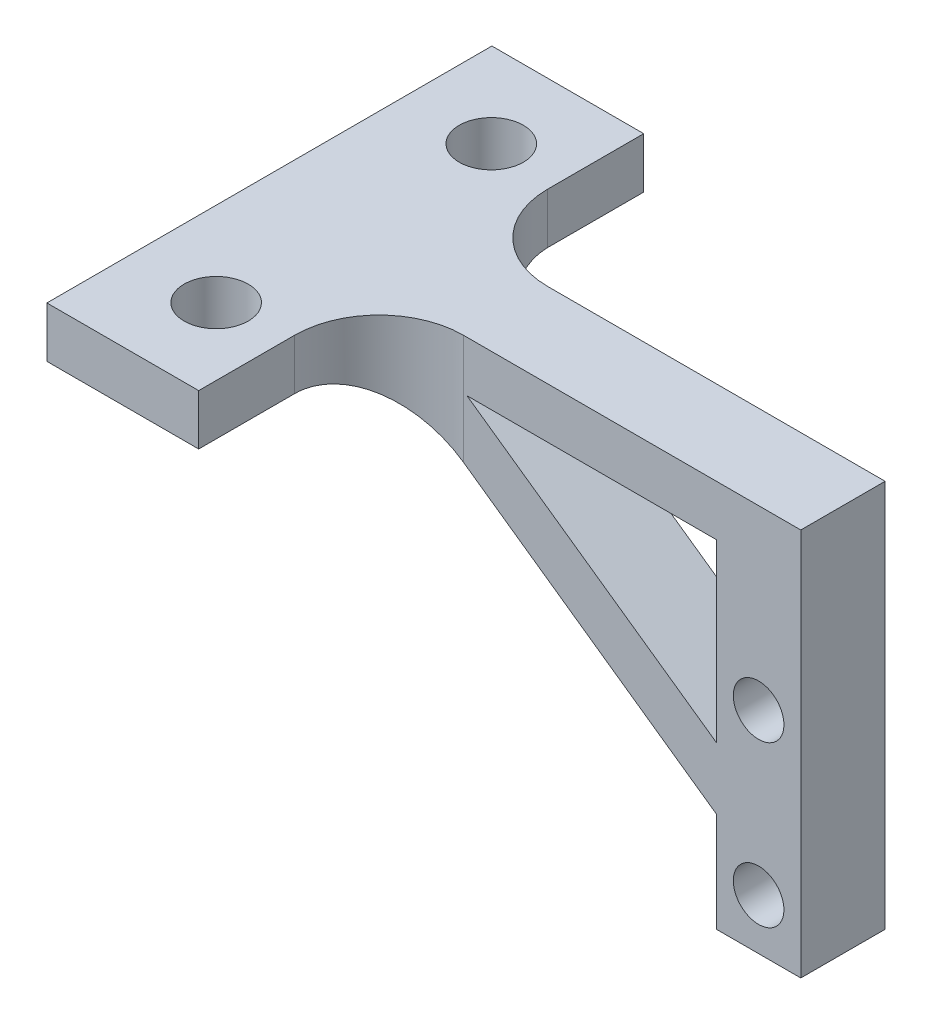
ISO-10303-21;
HEADER;
FILE_DESCRIPTION(('STEP AP214'),'2;1');
FILE_NAME('part.step','',(''),(''),'','','');
FILE_SCHEMA(('AUTOMOTIVE_DESIGN { 1 0 10303 214 1 1 1 1 }'));
ENDSEC;
DATA;
#1=APPLICATION_CONTEXT('core data for automotive mechanical design processes');
#2=APPLICATION_PROTOCOL_DEFINITION('international standard','automotive_design',2000,#1);
#3=PRODUCT_CONTEXT('',#1,'mechanical');
#4=PRODUCT('Part','Part','',(#3));
#5=PRODUCT_RELATED_PRODUCT_CATEGORY('part','',(#4));
#6=PRODUCT_DEFINITION_FORMATION('','',#4);
#7=PRODUCT_DEFINITION_CONTEXT('part definition',#1,'design');
#8=PRODUCT_DEFINITION('design','',#6,#7);
#9=PRODUCT_DEFINITION_SHAPE('','',#8);
#10=(LENGTH_UNIT() NAMED_UNIT(*) SI_UNIT(.MILLI.,.METRE.));
#11=(NAMED_UNIT(*) PLANE_ANGLE_UNIT() SI_UNIT($,.RADIAN.));
#12=(NAMED_UNIT(*) SI_UNIT($,.STERADIAN.) SOLID_ANGLE_UNIT());
#13=UNCERTAINTY_MEASURE_WITH_UNIT(LENGTH_MEASURE(1.E-05),#10,'distance_accuracy_value','');
#14=(GEOMETRIC_REPRESENTATION_CONTEXT(3) GLOBAL_UNCERTAINTY_ASSIGNED_CONTEXT((#13)) GLOBAL_UNIT_ASSIGNED_CONTEXT((#10,
#11,#12)) REPRESENTATION_CONTEXT('',''));
#15=CARTESIAN_POINT('',(0.,0.,0.));
#16=DIRECTION('',(0.,0.,1.));
#17=DIRECTION('',(1.,0.,0.));
#18=AXIS2_PLACEMENT_3D('',#15,#16,#17);
#19=CARTESIAN_POINT('',(0.,0.,0.));
#20=DIRECTION('',(0.,-1.,0.));
#21=DIRECTION('',(0.,0.,-1.));
#22=AXIS2_PLACEMENT_3D('',#19,#20,#21);
#23=PLANE('',#22);
#24=DIRECTION('',(-1.,0.,0.));
#25=VECTOR('',#24,1.);
#26=CARTESIAN_POINT('',(29.,0.,-5.655));
#27=LINE('',#26,#25);
#28=CARTESIAN_POINT('',(24.,0.,-5.655));
#29=VERTEX_POINT('',#28);
#30=CARTESIAN_POINT('',(9.21030531511632,0.,-5.655));
#31=VERTEX_POINT('',#30);
#32=EDGE_CURVE('E251',#29,#31,#27,.T.);
#33=ORIENTED_EDGE('',*,*,#32,.T.);
#34=DIRECTION('',(0.,0.,1.));
#35=VECTOR('',#34,1.);
#36=CARTESIAN_POINT('',(9.21030531511632,0.,-35.1167419759106));
#37=LINE('',#36,#35);
#38=CARTESIAN_POINT('',(9.21030531511632,0.,-10.655));
#39=VERTEX_POINT('',#38);
#40=EDGE_CURVE('E112',#39,#31,#37,.T.);
#41=ORIENTED_EDGE('',*,*,#40,.F.);
#42=DIRECTION('',(-1.,0.,0.));
#43=VECTOR('',#42,1.);
#44=CARTESIAN_POINT('',(29.,0.,-10.655));
#45=LINE('',#44,#43);
#46=CARTESIAN_POINT('',(24.,0.,-10.655));
#47=VERTEX_POINT('',#46);
#48=EDGE_CURVE('E248',#47,#39,#45,.T.);
#49=ORIENTED_EDGE('',*,*,#48,.F.);
#50=DIRECTION('',(0.,0.,-1.));
#51=VECTOR('',#50,1.);
#52=CARTESIAN_POINT('',(24.,0.,-5.655));
#53=LINE('',#52,#51);
#54=EDGE_CURVE('E279',#29,#47,#53,.T.);
#55=ORIENTED_EDGE('',*,*,#54,.F.);
#56=EDGE_LOOP('',(#33,#41,#49,#55));
#57=FACE_BOUND('',#56,.T.);
#58=ADVANCED_FACE('F33',(#57),#23,.T.);
#59=CARTESIAN_POINT('',(0.,0.,-16.31));
#60=DIRECTION('',(0.,1.,0.));
#61=DIRECTION('',(0.,0.,1.));
#62=AXIS2_PLACEMENT_3D('',#59,#60,#61);
#63=CIRCLE('',#62,1.9);
#64=CARTESIAN_POINT('',(0.,0.,-14.41));
#65=VERTEX_POINT('',#64);
#66=EDGE_CURVE('E183',#65,#65,#63,.T.);
#67=ORIENTED_EDGE('',*,*,#66,.T.);
#68=EDGE_LOOP('',(#67));
#69=FACE_BOUND('',#68,.T.);
#70=CARTESIAN_POINT('',(0.,0.,0.));
#71=DIRECTION('',(0.,1.,0.));
#72=DIRECTION('',(0.,0.,1.));
#73=AXIS2_PLACEMENT_3D('',#70,#71,#72);
#74=CIRCLE('',#73,1.9);
#75=CARTESIAN_POINT('',(0.,0.,1.9));
#76=VERTEX_POINT('',#75);
#77=EDGE_CURVE('E175',#76,#76,#74,.T.);
#78=ORIENTED_EDGE('',*,*,#77,.T.);
#79=EDGE_LOOP('',(#78));
#80=FACE_BOUND('',#79,.T.);
#81=DIRECTION('',(0.,0.,-1.));
#82=VECTOR('',#81,1.);
#83=CARTESIAN_POINT('',(4.,0.,5.035));
#84=LINE('',#83,#82);
#85=CARTESIAN_POINT('',(4.,0.,-15.655));
#86=VERTEX_POINT('',#85);
#87=CARTESIAN_POINT('',(4.,0.,-21.345));
#88=VERTEX_POINT('',#87);
#89=EDGE_CURVE('E134',#86,#88,#84,.T.);
#90=ORIENTED_EDGE('',*,*,#89,.F.);
#91=DIRECTION('',(0.,0.,1.));
#92=VECTOR('',#91,1.);
#93=CARTESIAN_POINT('',(4.,0.,-35.1167419759106));
#94=LINE('',#93,#92);
#95=CARTESIAN_POINT('',(4.,0.,-0.655));
#96=VERTEX_POINT('',#95);
#97=EDGE_CURVE('E48',#86,#96,#94,.T.);
#98=ORIENTED_EDGE('',*,*,#97,.T.);
#99=CARTESIAN_POINT('',(4.,0.,5.035));
#100=VERTEX_POINT('',#99);
#101=EDGE_CURVE('E137',#100,#96,#84,.T.);
#102=ORIENTED_EDGE('',*,*,#101,.F.);
#103=DIRECTION('',(1.,0.,0.));
#104=VECTOR('',#103,1.);
#105=CARTESIAN_POINT('',(-5.,0.,5.035));
#106=LINE('',#105,#104);
#107=CARTESIAN_POINT('',(-5.,0.,5.035));
#108=VERTEX_POINT('',#107);
#109=EDGE_CURVE('E138',#108,#100,#106,.T.);
#110=ORIENTED_EDGE('',*,*,#109,.F.);
#111=DIRECTION('',(0.,0.,1.));
#112=VECTOR('',#111,1.);
#113=CARTESIAN_POINT('',(-5.,0.,5.035));
#114=LINE('',#113,#112);
#115=CARTESIAN_POINT('',(-5.,0.,-21.345));
#116=VERTEX_POINT('',#115);
#117=EDGE_CURVE('E165',#116,#108,#114,.T.);
#118=ORIENTED_EDGE('',*,*,#117,.F.);
#119=DIRECTION('',(-1.,0.,0.));
#120=VECTOR('',#119,1.);
#121=CARTESIAN_POINT('',(-5.,0.,-21.345));
#122=LINE('',#121,#120);
#123=EDGE_CURVE('E145',#88,#116,#122,.T.);
#124=ORIENTED_EDGE('',*,*,#123,.F.);
#125=EDGE_LOOP('',(#90,#98,#102,#110,#118,#124));
#126=FACE_BOUND('',#125,.T.);
#127=ADVANCED_FACE('F206',(#69,#80,#126),#23,.T.);
#128=CARTESIAN_POINT('',(24.,-20.,-5.655));
#129=DIRECTION('',(1.,0.,0.));
#130=DIRECTION('',(0.,0.,-1.));
#131=AXIS2_PLACEMENT_3D('',#128,#129,#130);
#132=PLANE('',#131);
#133=DIRECTION('',(0.,0.,1.));
#134=VECTOR('',#133,1.);
#135=CARTESIAN_POINT('',(24.,-10.4153693518067,-35.1167419759106));
#136=LINE('',#135,#134);
#137=CARTESIAN_POINT('',(24.,-10.4153693518067,-10.655));
#138=VERTEX_POINT('',#137);
#139=CARTESIAN_POINT('',(24.,-10.4153693518067,-5.655));
#140=VERTEX_POINT('',#139);
#141=EDGE_CURVE('E108',#138,#140,#136,.T.);
#142=ORIENTED_EDGE('',*,*,#141,.T.);
#143=DIRECTION('',(0.,1.,0.));
#144=VECTOR('',#143,1.);
#145=CARTESIAN_POINT('',(24.,-20.,-5.655));
#146=LINE('',#145,#144);
#147=EDGE_CURVE('E298',#140,#29,#146,.T.);
#148=ORIENTED_EDGE('',*,*,#147,.T.);
#149=ORIENTED_EDGE('',*,*,#54,.T.);
#150=DIRECTION('',(0.,1.,0.));
#151=VECTOR('',#150,1.);
#152=CARTESIAN_POINT('',(24.,-20.,-10.655));
#153=LINE('',#152,#151);
#154=EDGE_CURVE('E261',#138,#47,#153,.T.);
#155=ORIENTED_EDGE('',*,*,#154,.F.);
#156=EDGE_LOOP('',(#142,#148,#149,#155));
#157=FACE_BOUND('',#156,.T.);
#158=ADVANCED_FACE('F335',(#157),#132,.F.);
#159=DIRECTION('',(0.,0.,1.));
#160=VECTOR('',#159,1.);
#161=CARTESIAN_POINT('',(24.,-14.0846306481933,-35.1167419759106));
#162=LINE('',#161,#160);
#163=CARTESIAN_POINT('',(24.,-14.0846306481933,-10.655));
#164=VERTEX_POINT('',#163);
#165=CARTESIAN_POINT('',(24.,-14.0846306481933,-5.655));
#166=VERTEX_POINT('',#165);
#167=EDGE_CURVE('E107',#164,#166,#162,.T.);
#168=ORIENTED_EDGE('',*,*,#167,.F.);
#169=CARTESIAN_POINT('',(24.,-20.,-10.655));
#170=VERTEX_POINT('',#169);
#171=EDGE_CURVE('E295',#170,#164,#153,.T.);
#172=ORIENTED_EDGE('',*,*,#171,.F.);
#173=DIRECTION('',(0.,0.,-1.));
#174=VECTOR('',#173,1.);
#175=CARTESIAN_POINT('',(24.,-20.,-5.655));
#176=LINE('',#175,#174);
#177=CARTESIAN_POINT('',(24.,-20.,-5.655));
#178=VERTEX_POINT('',#177);
#179=EDGE_CURVE('E282',#178,#170,#176,.T.);
#180=ORIENTED_EDGE('',*,*,#179,.F.);
#181=EDGE_CURVE('E301',#178,#166,#146,.T.);
#182=ORIENTED_EDGE('',*,*,#181,.T.);
#183=EDGE_LOOP('',(#168,#172,#180,#182));
#184=FACE_BOUND('',#183,.T.);
#185=ADVANCED_FACE('F347',(#184),#132,.F.);
#186=CARTESIAN_POINT('',(4.,3.,5.035));
#187=DIRECTION('',(-1.,0.,0.));
#188=DIRECTION('',(0.,0.,1.));
#189=AXIS2_PLACEMENT_3D('',#186,#187,#188);
#190=PLANE('',#189);
#191=DIRECTION('',(0.,0.,-1.));
#192=VECTOR('',#191,1.);
#193=CARTESIAN_POINT('',(4.,3.,5.035));
#194=LINE('',#193,#192);
#195=CARTESIAN_POINT('',(4.,3.,-15.655));
#196=VERTEX_POINT('',#195);
#197=CARTESIAN_POINT('',(4.,3.,-21.345));
#198=VERTEX_POINT('',#197);
#199=EDGE_CURVE('E139',#196,#198,#194,.T.);
#200=ORIENTED_EDGE('',*,*,#199,.F.);
#201=DIRECTION('',(0.,1.,0.));
#202=VECTOR('',#201,1.);
#203=CARTESIAN_POINT('',(4.,0.,-15.655));
#204=LINE('',#203,#202);
#205=EDGE_CURVE('E101',#196,#86,#204,.F.);
#206=ORIENTED_EDGE('',*,*,#205,.T.);
#207=ORIENTED_EDGE('',*,*,#89,.T.);
#208=DIRECTION('',(0.,-1.,0.));
#209=VECTOR('',#208,1.);
#210=CARTESIAN_POINT('',(4.,3.,-21.345));
#211=LINE('',#210,#209);
#212=EDGE_CURVE('E202',#198,#88,#211,.T.);
#213=ORIENTED_EDGE('',*,*,#212,.F.);
#214=EDGE_LOOP('',(#200,#206,#207,#213));
#215=FACE_BOUND('',#214,.T.);
#216=ADVANCED_FACE('F344',(#215),#190,.F.);
#217=ORIENTED_EDGE('',*,*,#101,.T.);
#218=DIRECTION('',(0.,-1.,0.));
#219=VECTOR('',#218,1.);
#220=CARTESIAN_POINT('',(4.,3.,-0.655000000000001));
#221=LINE('',#220,#219);
#222=CARTESIAN_POINT('',(4.,3.,-0.655000000000001));
#223=VERTEX_POINT('',#222);
#224=EDGE_CURVE('E56',#96,#223,#221,.F.);
#225=ORIENTED_EDGE('',*,*,#224,.T.);
#226=CARTESIAN_POINT('',(4.,3.,5.035));
#227=VERTEX_POINT('',#226);
#228=EDGE_CURVE('E152',#227,#223,#194,.T.);
#229=ORIENTED_EDGE('',*,*,#228,.F.);
#230=DIRECTION('',(0.,-1.,0.));
#231=VECTOR('',#230,1.);
#232=CARTESIAN_POINT('',(4.,3.,5.035));
#233=LINE('',#232,#231);
#234=EDGE_CURVE('E216',#227,#100,#233,.T.);
#235=ORIENTED_EDGE('',*,*,#234,.T.);
#236=EDGE_LOOP('',(#217,#225,#229,#235));
#237=FACE_BOUND('',#236,.T.);
#238=ADVANCED_FACE('F218',(#237),#190,.F.);
#239=CARTESIAN_POINT('',(0.,3.,0.));
#240=DIRECTION('',(0.,-1.,0.));
#241=DIRECTION('',(0.,0.,-1.));
#242=AXIS2_PLACEMENT_3D('',#239,#240,#241);
#243=PLANE('',#242);
#244=CARTESIAN_POINT('',(0.,3.,0.));
#245=DIRECTION('',(0.,1.,0.));
#246=DIRECTION('',(0.,0.,1.));
#247=AXIS2_PLACEMENT_3D('',#244,#245,#246);
#248=CIRCLE('',#247,1.9);
#249=CARTESIAN_POINT('',(0.,3.,1.9));
#250=VERTEX_POINT('',#249);
#251=EDGE_CURVE('E167',#250,#250,#248,.T.);
#252=ORIENTED_EDGE('',*,*,#251,.F.);
#253=EDGE_LOOP('',(#252));
#254=FACE_BOUND('',#253,.T.);
#255=DIRECTION('',(0.,0.,1.));
#256=VECTOR('',#255,1.);
#257=CARTESIAN_POINT('',(-5.,3.,5.035));
#258=LINE('',#257,#256);
#259=CARTESIAN_POINT('',(-5.,3.,-21.345));
#260=VERTEX_POINT('',#259);
#261=CARTESIAN_POINT('',(-5.,3.,5.035));
#262=VERTEX_POINT('',#261);
#263=EDGE_CURVE('E185',#260,#262,#258,.T.);
#264=ORIENTED_EDGE('',*,*,#263,.T.);
#265=DIRECTION('',(1.,0.,0.));
#266=VECTOR('',#265,1.);
#267=CARTESIAN_POINT('',(-5.,3.,5.035));
#268=LINE('',#267,#266);
#269=EDGE_CURVE('E160',#262,#227,#268,.T.);
#270=ORIENTED_EDGE('',*,*,#269,.T.);
#271=ORIENTED_EDGE('',*,*,#228,.T.);
#272=CARTESIAN_POINT('',(9.,3.,-0.655000000000002));
#273=DIRECTION('',(0.,-1.,0.));
#274=DIRECTION('',(0.,0.,-1.));
#275=AXIS2_PLACEMENT_3D('',#272,#273,#274);
#276=CIRCLE('',#275,5.);
#277=CARTESIAN_POINT('',(9.,3.,-5.655));
#278=VERTEX_POINT('',#277);
#279=EDGE_CURVE('E11',#223,#278,#276,.T.);
#280=ORIENTED_EDGE('',*,*,#279,.T.);
#281=DIRECTION('',(-1.,0.,0.));
#282=VECTOR('',#281,1.);
#283=CARTESIAN_POINT('',(29.,3.,-5.655));
#284=LINE('',#283,#282);
#285=CARTESIAN_POINT('',(29.,3.,-5.655));
#286=VERTEX_POINT('',#285);
#287=EDGE_CURVE('E100',#286,#278,#284,.T.);
#288=ORIENTED_EDGE('',*,*,#287,.F.);
#289=DIRECTION('',(0.,0.,1.));
#290=VECTOR('',#289,1.);
#291=CARTESIAN_POINT('',(29.,3.,-10.655));
#292=LINE('',#291,#290);
#293=CARTESIAN_POINT('',(29.,3.,-10.655));
#294=VERTEX_POINT('',#293);
#295=EDGE_CURVE('E371',#294,#286,#292,.T.);
#296=ORIENTED_EDGE('',*,*,#295,.F.);
#297=DIRECTION('',(-1.,0.,0.));
#298=VECTOR('',#297,1.);
#299=CARTESIAN_POINT('',(29.,3.,-10.655));
#300=LINE('',#299,#298);
#301=CARTESIAN_POINT('',(9.,3.,-10.655));
#302=VERTEX_POINT('',#301);
#303=EDGE_CURVE('E368',#294,#302,#300,.T.);
#304=ORIENTED_EDGE('',*,*,#303,.T.);
#305=CARTESIAN_POINT('',(9.,3.,-15.655));
#306=DIRECTION('',(0.,-1.,0.));
#307=DIRECTION('',(0.,0.,-1.));
#308=AXIS2_PLACEMENT_3D('',#305,#306,#307);
#309=CIRCLE('',#308,5.);
#310=EDGE_CURVE('E76',#302,#196,#309,.T.);
#311=ORIENTED_EDGE('',*,*,#310,.T.);
#312=ORIENTED_EDGE('',*,*,#199,.T.);
#313=DIRECTION('',(-1.,0.,0.));
#314=VECTOR('',#313,1.);
#315=CARTESIAN_POINT('',(-5.,3.,-21.345));
#316=LINE('',#315,#314);
#317=EDGE_CURVE('E154',#198,#260,#316,.T.);
#318=ORIENTED_EDGE('',*,*,#317,.T.);
#319=EDGE_LOOP('',(#264,#270,#271,#280,#288,#296,#304,#311,#312,#318));
#320=FACE_BOUND('',#319,.T.);
#321=CARTESIAN_POINT('',(0.,3.,-16.31));
#322=DIRECTION('',(0.,1.,0.));
#323=DIRECTION('',(0.,0.,1.));
#324=AXIS2_PLACEMENT_3D('',#321,#322,#323);
#325=CIRCLE('',#324,1.9);
#326=CARTESIAN_POINT('',(0.,3.,-14.41));
#327=VERTEX_POINT('',#326);
#328=EDGE_CURVE('E180',#327,#327,#325,.T.);
#329=ORIENTED_EDGE('',*,*,#328,.F.);
#330=EDGE_LOOP('',(#329));
#331=FACE_BOUND('',#330,.T.);
#332=ADVANCED_FACE('F339',(#254,#320,#331),#243,.F.);
#333=CARTESIAN_POINT('',(-5.,3.,5.035));
#334=DIRECTION('',(1.,0.,0.));
#335=DIRECTION('',(0.,0.,-1.));
#336=AXIS2_PLACEMENT_3D('',#333,#334,#335);
#337=PLANE('',#336);
#338=ORIENTED_EDGE('',*,*,#117,.T.);
#339=DIRECTION('',(0.,-1.,0.));
#340=VECTOR('',#339,1.);
#341=CARTESIAN_POINT('',(-5.,3.,5.035));
#342=LINE('',#341,#340);
#343=EDGE_CURVE('E133',#262,#108,#342,.T.);
#344=ORIENTED_EDGE('',*,*,#343,.F.);
#345=ORIENTED_EDGE('',*,*,#263,.F.);
#346=DIRECTION('',(0.,-1.,0.));
#347=VECTOR('',#346,1.);
#348=CARTESIAN_POINT('',(-5.,3.,-21.345));
#349=LINE('',#348,#347);
#350=EDGE_CURVE('E164',#260,#116,#349,.T.);
#351=ORIENTED_EDGE('',*,*,#350,.T.);
#352=EDGE_LOOP('',(#338,#344,#345,#351));
#353=FACE_BOUND('',#352,.T.);
#354=ADVANCED_FACE('F204',(#353),#337,.F.);
#355=CARTESIAN_POINT('',(-5.,3.,5.035));
#356=DIRECTION('',(0.,0.,-1.));
#357=DIRECTION('',(-1.,0.,0.));
#358=AXIS2_PLACEMENT_3D('',#355,#356,#357);
#359=PLANE('',#358);
#360=ORIENTED_EDGE('',*,*,#109,.T.);
#361=ORIENTED_EDGE('',*,*,#234,.F.);
#362=ORIENTED_EDGE('',*,*,#269,.F.);
#363=ORIENTED_EDGE('',*,*,#343,.T.);
#364=EDGE_LOOP('',(#360,#361,#362,#363));
#365=FACE_BOUND('',#364,.T.);
#366=ADVANCED_FACE('F215',(#365),#359,.F.);
#367=CARTESIAN_POINT('',(-5.,3.,-21.345));
#368=DIRECTION('',(0.,0.,1.));
#369=DIRECTION('',(1.,0.,0.));
#370=AXIS2_PLACEMENT_3D('',#367,#368,#369);
#371=PLANE('',#370);
#372=ORIENTED_EDGE('',*,*,#123,.T.);
#373=ORIENTED_EDGE('',*,*,#350,.F.);
#374=ORIENTED_EDGE('',*,*,#317,.F.);
#375=ORIENTED_EDGE('',*,*,#212,.T.);
#376=EDGE_LOOP('',(#372,#373,#374,#375));
#377=FACE_BOUND('',#376,.T.);
#378=ADVANCED_FACE('F197',(#377),#371,.F.);
#379=CARTESIAN_POINT('',(0.,3.,0.));
#380=DIRECTION('',(0.,-1.,0.));
#381=DIRECTION('',(0.,0.,-1.));
#382=AXIS2_PLACEMENT_3D('',#379,#380,#381);
#383=CYLINDRICAL_SURFACE('',#382,1.9);
#384=ORIENTED_EDGE('',*,*,#251,.T.);
#385=EDGE_LOOP('',(#384));
#386=FACE_BOUND('',#385,.T.);
#387=ORIENTED_EDGE('',*,*,#77,.F.);
#388=EDGE_LOOP('',(#387));
#389=FACE_BOUND('',#388,.T.);
#390=ADVANCED_FACE('F343',(#386,#389),#383,.F.);
#391=CARTESIAN_POINT('',(0.,3.,-16.31));
#392=DIRECTION('',(0.,-1.,0.));
#393=DIRECTION('',(0.,0.,-1.));
#394=AXIS2_PLACEMENT_3D('',#391,#392,#393);
#395=CYLINDRICAL_SURFACE('',#394,1.9);
#396=ORIENTED_EDGE('',*,*,#328,.T.);
#397=EDGE_LOOP('',(#396));
#398=FACE_BOUND('',#397,.T.);
#399=ORIENTED_EDGE('',*,*,#66,.F.);
#400=EDGE_LOOP('',(#399));
#401=FACE_BOUND('',#400,.T.);
#402=ADVANCED_FACE('F421',(#398,#401),#395,.F.);
#403=CARTESIAN_POINT('',(29.,0.,-10.655));
#404=DIRECTION('',(0.,0.,1.));
#405=DIRECTION('',(0.,-1.,0.));
#406=AXIS2_PLACEMENT_3D('',#403,#404,#405);
#407=PLANE('',#406);
#408=DIRECTION('',(0.81760326062206,-0.575781997131012,0.));
#409=VECTOR('',#408,1.);
#410=CARTESIAN_POINT('',(24.,-14.0846306481933,-10.655));
#411=LINE('',#410,#409);
#412=CARTESIAN_POINT('',(8.99999999999999,-3.52115766204832,-10.655));
#413=VERTEX_POINT('',#412);
#414=EDGE_CURVE('E127',#413,#164,#411,.T.);
#415=ORIENTED_EDGE('',*,*,#414,.F.);
#416=DIRECTION('',(0.,1.,0.));
#417=VECTOR('',#416,1.);
#418=CARTESIAN_POINT('',(9.,3.,-10.655));
#419=LINE('',#418,#417);
#420=EDGE_CURVE('E131',#413,#302,#419,.T.);
#421=ORIENTED_EDGE('',*,*,#420,.T.);
#422=ORIENTED_EDGE('',*,*,#303,.F.);
#423=DIRECTION('',(0.,1.,0.));
#424=VECTOR('',#423,1.);
#425=CARTESIAN_POINT('',(29.,0.,-10.655));
#426=LINE('',#425,#424);
#427=CARTESIAN_POINT('',(29.,-20.,-10.655));
#428=VERTEX_POINT('',#427);
#429=EDGE_CURVE('E290',#428,#294,#426,.T.);
#430=ORIENTED_EDGE('',*,*,#429,.F.);
#431=DIRECTION('',(1.,0.,0.));
#432=VECTOR('',#431,1.);
#433=CARTESIAN_POINT('',(29.,-20.,-10.655));
#434=LINE('',#433,#432);
#435=EDGE_CURVE('E285',#170,#428,#434,.T.);
#436=ORIENTED_EDGE('',*,*,#435,.F.);
#437=ORIENTED_EDGE('',*,*,#171,.T.);
#438=EDGE_LOOP('',(#415,#421,#422,#430,#436,#437));
#439=FACE_BOUND('',#438,.T.);
#440=CARTESIAN_POINT('',(26.5,-7.5,-10.655));
#441=DIRECTION('',(0.,0.,-1.));
#442=DIRECTION('',(-1.,0.,0.));
#443=AXIS2_PLACEMENT_3D('',#440,#441,#442);
#444=CIRCLE('',#443,1.5);
#445=CARTESIAN_POINT('',(25.,-7.5,-10.655));
#446=VERTEX_POINT('',#445);
#447=EDGE_CURVE('E129',#446,#446,#444,.T.);
#448=ORIENTED_EDGE('',*,*,#447,.F.);
#449=EDGE_LOOP('',(#448));
#450=FACE_BOUND('',#449,.T.);
#451=CARTESIAN_POINT('',(26.5,-17.,-10.655));
#452=DIRECTION('',(0.,0.,-1.));
#453=DIRECTION('',(-1.,0.,0.));
#454=AXIS2_PLACEMENT_3D('',#451,#452,#453);
#455=CIRCLE('',#454,1.5);
#456=CARTESIAN_POINT('',(25.,-17.,-10.655));
#457=VERTEX_POINT('',#456);
#458=EDGE_CURVE('E271',#457,#457,#455,.T.);
#459=ORIENTED_EDGE('',*,*,#458,.F.);
#460=EDGE_LOOP('',(#459));
#461=FACE_BOUND('',#460,.T.);
#462=ORIENTED_EDGE('',*,*,#48,.T.);
#463=DIRECTION('',(-0.81760326062206,0.575781997131012,0.));
#464=VECTOR('',#463,1.);
#465=CARTESIAN_POINT('',(24.,-10.4153693518067,-10.655));
#466=LINE('',#465,#464);
#467=EDGE_CURVE('E130',#138,#39,#466,.T.);
#468=ORIENTED_EDGE('',*,*,#467,.F.);
#469=ORIENTED_EDGE('',*,*,#154,.T.);
#470=EDGE_LOOP('',(#462,#468,#469));
#471=FACE_BOUND('',#470,.T.);
#472=ADVANCED_FACE('F259',(#439,#450,#461,#471),#407,.F.);
#473=CARTESIAN_POINT('',(29.,0.,-5.655));
#474=DIRECTION('',(0.,0.,-1.));
#475=DIRECTION('',(0.,1.,0.));
#476=AXIS2_PLACEMENT_3D('',#473,#474,#475);
#477=PLANE('',#476);
#478=ORIENTED_EDGE('',*,*,#287,.T.);
#479=DIRECTION('',(0.,-1.,0.));
#480=VECTOR('',#479,1.);
#481=CARTESIAN_POINT('',(9.,0.,-5.655));
#482=LINE('',#481,#480);
#483=CARTESIAN_POINT('',(9.,-3.52115766204832,-5.655));
#484=VERTEX_POINT('',#483);
#485=EDGE_CURVE('E86',#278,#484,#482,.T.);
#486=ORIENTED_EDGE('',*,*,#485,.T.);
#487=DIRECTION('',(0.81760326062206,-0.575781997131012,0.));
#488=VECTOR('',#487,1.);
#489=CARTESIAN_POINT('',(24.,-14.0846306481933,-5.655));
#490=LINE('',#489,#488);
#491=EDGE_CURVE('E96',#484,#166,#490,.T.);
#492=ORIENTED_EDGE('',*,*,#491,.T.);
#493=ORIENTED_EDGE('',*,*,#181,.F.);
#494=DIRECTION('',(-1.,0.,0.));
#495=VECTOR('',#494,1.);
#496=CARTESIAN_POINT('',(29.,-20.,-5.655));
#497=LINE('',#496,#495);
#498=CARTESIAN_POINT('',(29.,-20.,-5.655));
#499=VERTEX_POINT('',#498);
#500=EDGE_CURVE('E278',#499,#178,#497,.T.);
#501=ORIENTED_EDGE('',*,*,#500,.F.);
#502=DIRECTION('',(0.,-1.,0.));
#503=VECTOR('',#502,1.);
#504=CARTESIAN_POINT('',(29.,0.,-5.655));
#505=LINE('',#504,#503);
#506=EDGE_CURVE('E262',#286,#499,#505,.T.);
#507=ORIENTED_EDGE('',*,*,#506,.F.);
#508=EDGE_LOOP('',(#478,#486,#492,#493,#501,#507));
#509=FACE_BOUND('',#508,.T.);
#510=CARTESIAN_POINT('',(26.5,-7.5,-5.655));
#511=DIRECTION('',(0.,0.,-1.));
#512=DIRECTION('',(0.,1.,0.));
#513=AXIS2_PLACEMENT_3D('',#510,#511,#512);
#514=CIRCLE('',#513,1.5);
#515=CARTESIAN_POINT('',(26.5,-5.99999999999999,-5.655));
#516=VERTEX_POINT('',#515);
#517=EDGE_CURVE('E270',#516,#516,#514,.T.);
#518=ORIENTED_EDGE('',*,*,#517,.T.);
#519=EDGE_LOOP('',(#518));
#520=FACE_BOUND('',#519,.T.);
#521=CARTESIAN_POINT('',(26.5,-17.,-5.655));
#522=DIRECTION('',(0.,0.,-1.));
#523=DIRECTION('',(0.,1.,0.));
#524=AXIS2_PLACEMENT_3D('',#521,#522,#523);
#525=CIRCLE('',#524,1.5);
#526=CARTESIAN_POINT('',(26.5,-15.5,-5.655));
#527=VERTEX_POINT('',#526);
#528=EDGE_CURVE('E274',#527,#527,#525,.T.);
#529=ORIENTED_EDGE('',*,*,#528,.T.);
#530=EDGE_LOOP('',(#529));
#531=FACE_BOUND('',#530,.T.);
#532=DIRECTION('',(-0.81760326062206,0.575781997131012,0.));
#533=VECTOR('',#532,1.);
#534=CARTESIAN_POINT('',(24.,-10.4153693518067,-5.655));
#535=LINE('',#534,#533);
#536=EDGE_CURVE('E109',#140,#31,#535,.T.);
#537=ORIENTED_EDGE('',*,*,#536,.T.);
#538=ORIENTED_EDGE('',*,*,#32,.F.);
#539=ORIENTED_EDGE('',*,*,#147,.F.);
#540=EDGE_LOOP('',(#537,#538,#539));
#541=FACE_BOUND('',#540,.T.);
#542=ADVANCED_FACE('F92',(#509,#520,#531,#541),#477,.F.);
#543=CARTESIAN_POINT('',(29.,0.,0.));
#544=DIRECTION('',(1.,0.,0.));
#545=DIRECTION('',(0.,0.,-1.));
#546=AXIS2_PLACEMENT_3D('',#543,#544,#545);
#547=PLANE('',#546);
#548=ORIENTED_EDGE('',*,*,#429,.T.);
#549=ORIENTED_EDGE('',*,*,#295,.T.);
#550=ORIENTED_EDGE('',*,*,#506,.T.);
#551=DIRECTION('',(0.,0.,1.));
#552=VECTOR('',#551,1.);
#553=CARTESIAN_POINT('',(29.,-20.,-5.655));
#554=LINE('',#553,#552);
#555=EDGE_CURVE('E275',#428,#499,#554,.T.);
#556=ORIENTED_EDGE('',*,*,#555,.F.);
#557=EDGE_LOOP('',(#548,#549,#550,#556));
#558=FACE_BOUND('',#557,.T.);
#559=ADVANCED_FACE('F327',(#558),#547,.T.);
#560=CARTESIAN_POINT('',(0.,-20.,0.));
#561=DIRECTION('',(0.,1.,0.));
#562=DIRECTION('',(0.,0.,1.));
#563=AXIS2_PLACEMENT_3D('',#560,#561,#562);
#564=PLANE('',#563);
#565=ORIENTED_EDGE('',*,*,#555,.T.);
#566=ORIENTED_EDGE('',*,*,#500,.T.);
#567=ORIENTED_EDGE('',*,*,#179,.T.);
#568=ORIENTED_EDGE('',*,*,#435,.T.);
#569=EDGE_LOOP('',(#565,#566,#567,#568));
#570=FACE_BOUND('',#569,.T.);
#571=ADVANCED_FACE('F318',(#570),#564,.F.);
#572=CARTESIAN_POINT('',(26.5,-17.,9.345));
#573=DIRECTION('',(0.,0.,-1.));
#574=DIRECTION('',(-1.,0.,0.));
#575=AXIS2_PLACEMENT_3D('',#572,#573,#574);
#576=CYLINDRICAL_SURFACE('',#575,1.5);
#577=ORIENTED_EDGE('',*,*,#458,.T.);
#578=EDGE_LOOP('',(#577));
#579=FACE_BOUND('',#578,.T.);
#580=ORIENTED_EDGE('',*,*,#528,.F.);
#581=EDGE_LOOP('',(#580));
#582=FACE_BOUND('',#581,.T.);
#583=ADVANCED_FACE('F315',(#579,#582),#576,.F.);
#584=CARTESIAN_POINT('',(26.5,-7.5,9.345));
#585=DIRECTION('',(0.,0.,-1.));
#586=DIRECTION('',(-1.,0.,0.));
#587=AXIS2_PLACEMENT_3D('',#584,#585,#586);
#588=CYLINDRICAL_SURFACE('',#587,1.5);
#589=ORIENTED_EDGE('',*,*,#447,.T.);
#590=EDGE_LOOP('',(#589));
#591=FACE_BOUND('',#590,.T.);
#592=ORIENTED_EDGE('',*,*,#517,.F.);
#593=EDGE_LOOP('',(#592));
#594=FACE_BOUND('',#593,.T.);
#595=ADVANCED_FACE('F317',(#591,#594),#588,.F.);
#596=CARTESIAN_POINT('',(24.,-10.4153693518067,-35.1167419759106));
#597=DIRECTION('',(-0.575781997131012,-0.81760326062206,0.));
#598=DIRECTION('',(0.81760326062206,-0.575781997131012,0.));
#599=AXIS2_PLACEMENT_3D('',#596,#597,#598);
#600=PLANE('',#599);
#601=ORIENTED_EDGE('',*,*,#141,.F.);
#602=ORIENTED_EDGE('',*,*,#467,.T.);
#603=ORIENTED_EDGE('',*,*,#40,.T.);
#604=ORIENTED_EDGE('',*,*,#536,.F.);
#605=EDGE_LOOP('',(#601,#602,#603,#604));
#606=FACE_BOUND('',#605,.T.);
#607=ADVANCED_FACE('F264',(#606),#600,.F.);
#608=CARTESIAN_POINT('',(24.,-14.0846306481933,-35.1167419759106));
#609=DIRECTION('',(0.575781997131012,0.81760326062206,0.));
#610=DIRECTION('',(-0.81760326062206,0.575781997131012,0.));
#611=AXIS2_PLACEMENT_3D('',#608,#609,#610);
#612=PLANE('',#611);
#613=ORIENTED_EDGE('',*,*,#97,.F.);
#614=CARTESIAN_POINT('',(9.,-3.52115766204832,-15.655));
#615=DIRECTION('',(0.575781997131012,0.81760326062206,0.));
#616=DIRECTION('',(0.81760326062206,-0.575781997131012,0.));
#617=AXIS2_PLACEMENT_3D('',#614,#615,#616);
#618=ELLIPSE('',#617,6.11543549397765,5.);
#619=EDGE_CURVE('E88',#86,#413,#618,.T.);
#620=ORIENTED_EDGE('',*,*,#619,.T.);
#621=ORIENTED_EDGE('',*,*,#414,.T.);
#622=ORIENTED_EDGE('',*,*,#167,.T.);
#623=ORIENTED_EDGE('',*,*,#491,.F.);
#624=CARTESIAN_POINT('',(9.,-3.52115766204832,-0.655));
#625=DIRECTION('',(0.575781997131012,0.81760326062206,0.));
#626=DIRECTION('',(-0.81760326062206,0.575781997131012,0.));
#627=AXIS2_PLACEMENT_3D('',#624,#625,#626);
#628=ELLIPSE('',#627,6.11543549397765,5.);
#629=EDGE_CURVE('E41',#484,#96,#628,.T.);
#630=ORIENTED_EDGE('',*,*,#629,.T.);
#631=EDGE_LOOP('',(#613,#620,#621,#622,#623,#630));
#632=FACE_BOUND('',#631,.T.);
#633=ADVANCED_FACE('F104',(#632),#612,.F.);
#634=CARTESIAN_POINT('',(9.,0.,-15.655));
#635=DIRECTION('',(0.,-1.,0.));
#636=DIRECTION('',(0.,0.,-1.));
#637=AXIS2_PLACEMENT_3D('',#634,#635,#636);
#638=CYLINDRICAL_SURFACE('',#637,5.);
#639=ORIENTED_EDGE('',*,*,#619,.F.);
#640=ORIENTED_EDGE('',*,*,#205,.F.);
#641=ORIENTED_EDGE('',*,*,#310,.F.);
#642=ORIENTED_EDGE('',*,*,#420,.F.);
#643=EDGE_LOOP('',(#639,#640,#641,#642));
#644=FACE_BOUND('',#643,.T.);
#645=ADVANCED_FACE('F352',(#644),#638,.F.);
#646=CARTESIAN_POINT('',(9.,0.,-0.655000000000001));
#647=DIRECTION('',(0.,1.,0.));
#648=DIRECTION('',(0.,0.,1.));
#649=AXIS2_PLACEMENT_3D('',#646,#647,#648);
#650=CYLINDRICAL_SURFACE('',#649,5.);
#651=ORIENTED_EDGE('',*,*,#279,.F.);
#652=ORIENTED_EDGE('',*,*,#224,.F.);
#653=ORIENTED_EDGE('',*,*,#629,.F.);
#654=ORIENTED_EDGE('',*,*,#485,.F.);
#655=EDGE_LOOP('',(#651,#652,#653,#654));
#656=FACE_BOUND('',#655,.T.);
#657=ADVANCED_FACE('F35',(#656),#650,.F.);
#658=CLOSED_SHELL('',(#58,#127,#158,#185,#216,#238,#332,#354,#366,#378,#390,#402,#472,#542,#559,
#571,#583,#595,#607,#633,#645,#657));
#659=MANIFOLD_SOLID_BREP('B2',#658);
#660=ADVANCED_BREP_SHAPE_REPRESENTATION('',(#18,#659),#14);
#661=SHAPE_DEFINITION_REPRESENTATION(#9,#660);
ENDSEC;
END-ISO-10303-21;
